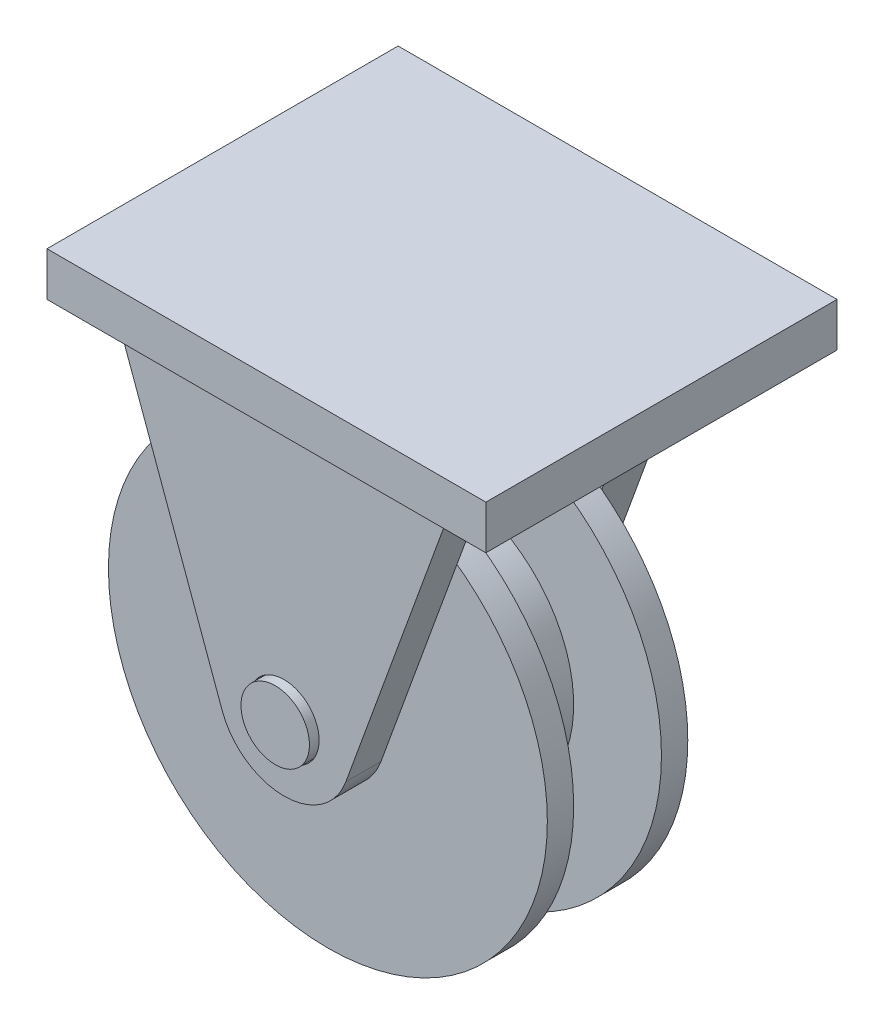
ISO-10303-21;
HEADER;
FILE_DESCRIPTION(('STEP AP214'),'2;1');
FILE_NAME('part.step','',(''),(''),'','','');
FILE_SCHEMA(('AUTOMOTIVE_DESIGN { 1 0 10303 214 1 1 1 1 }'));
ENDSEC;
DATA;
#1=APPLICATION_CONTEXT('core data for automotive mechanical design processes');
#2=APPLICATION_PROTOCOL_DEFINITION('international standard','automotive_design',2000,#1);
#3=PRODUCT_CONTEXT('',#1,'mechanical');
#4=PRODUCT('Part','Part','',(#3));
#5=PRODUCT_RELATED_PRODUCT_CATEGORY('part','',(#4));
#6=PRODUCT_DEFINITION_FORMATION('','',#4);
#7=PRODUCT_DEFINITION_CONTEXT('part definition',#1,'design');
#8=PRODUCT_DEFINITION('design','',#6,#7);
#9=PRODUCT_DEFINITION_SHAPE('','',#8);
#10=(LENGTH_UNIT() NAMED_UNIT(*) SI_UNIT(.MILLI.,.METRE.));
#11=(NAMED_UNIT(*) PLANE_ANGLE_UNIT() SI_UNIT($,.RADIAN.));
#12=(NAMED_UNIT(*) SI_UNIT($,.STERADIAN.) SOLID_ANGLE_UNIT());
#13=UNCERTAINTY_MEASURE_WITH_UNIT(LENGTH_MEASURE(1.E-05),#10,'distance_accuracy_value','');
#14=(GEOMETRIC_REPRESENTATION_CONTEXT(3) GLOBAL_UNCERTAINTY_ASSIGNED_CONTEXT((#13)) GLOBAL_UNIT_ASSIGNED_CONTEXT((#10,
#11,#12)) REPRESENTATION_CONTEXT('',''));
#15=CARTESIAN_POINT('',(0.,0.,0.));
#16=DIRECTION('',(0.,0.,1.));
#17=DIRECTION('',(1.,0.,0.));
#18=AXIS2_PLACEMENT_3D('',#15,#16,#17);
#19=CARTESIAN_POINT('',(0.,0.,-13.));
#20=DIRECTION('',(0.,0.,-1.));
#21=DIRECTION('',(1.,0.,0.));
#22=AXIS2_PLACEMENT_3D('',#19,#20,#21);
#23=PLANE('',#22);
#24=CARTESIAN_POINT('',(0.,0.,-13.));
#25=DIRECTION('',(0.,0.,1.));
#26=DIRECTION('',(1.,0.,0.));
#27=AXIS2_PLACEMENT_3D('',#24,#25,#26);
#28=CIRCLE('',#27,25.);
#29=CARTESIAN_POINT('',(-15.2043552157091,19.8450896313052,-13.));
#30=VERTEX_POINT('',#29);
#31=CARTESIAN_POINT('',(15.2043552157091,19.8450896313052,-13.));
#32=VERTEX_POINT('',#31);
#33=EDGE_CURVE('E92',#30,#32,#28,.T.);
#34=ORIENTED_EDGE('',*,*,#33,.F.);
#35=DIRECTION('',(0.342020143325663,-0.93969262078591,0.));
#36=VECTOR('',#35,1.);
#37=CARTESIAN_POINT('',(-18.9004403215552,30.,-13.));
#38=LINE('',#37,#36);
#39=CARTESIAN_POINT('',(-7.04769465589432,-2.56515107494247,-13.));
#40=VERTEX_POINT('',#39);
#41=EDGE_CURVE('E80',#30,#40,#38,.T.);
#42=ORIENTED_EDGE('',*,*,#41,.T.);
#43=CARTESIAN_POINT('',(0.,0.,-13.));
#44=DIRECTION('',(0.,0.,1.));
#45=DIRECTION('',(1.,0.,0.));
#46=AXIS2_PLACEMENT_3D('',#43,#44,#45);
#47=CIRCLE('',#46,7.5);
#48=CARTESIAN_POINT('',(7.04769465589432,-2.56515107494248,-13.));
#49=VERTEX_POINT('',#48);
#50=EDGE_CURVE('E302',#40,#49,#47,.T.);
#51=ORIENTED_EDGE('',*,*,#50,.T.);
#52=DIRECTION('',(-0.342020143325663,-0.93969262078591,0.));
#53=VECTOR('',#52,1.);
#54=CARTESIAN_POINT('',(18.9004403215552,30.,-13.));
#55=LINE('',#54,#53);
#56=EDGE_CURVE('E206',#32,#49,#55,.T.);
#57=ORIENTED_EDGE('',*,*,#56,.F.);
#58=EDGE_LOOP('',(#34,#42,#51,#57));
#59=FACE_BOUND('',#58,.T.);
#60=ADVANCED_FACE('F71',(#59),#23,.T.);
#61=CARTESIAN_POINT('',(0.,0.,3.));
#62=DIRECTION('',(0.,0.,-1.));
#63=DIRECTION('',(-1.,0.,0.));
#64=AXIS2_PLACEMENT_3D('',#61,#62,#63);
#65=CYLINDRICAL_SURFACE('',#64,25.);
#66=CARTESIAN_POINT('',(0.,0.,3.));
#67=DIRECTION('',(0.,0.,1.));
#68=DIRECTION('',(1.,0.,0.));
#69=AXIS2_PLACEMENT_3D('',#66,#67,#68);
#70=CIRCLE('',#69,25.);
#71=CARTESIAN_POINT('',(25.,0.,3.));
#72=VERTEX_POINT('',#71);
#73=EDGE_CURVE('E193',#72,#72,#70,.T.);
#74=ORIENTED_EDGE('',*,*,#73,.F.);
#75=EDGE_LOOP('',(#74));
#76=FACE_BOUND('',#75,.T.);
#77=CARTESIAN_POINT('',(0.,0.,0.));
#78=DIRECTION('',(0.,0.,1.));
#79=DIRECTION('',(1.,0.,0.));
#80=AXIS2_PLACEMENT_3D('',#77,#78,#79);
#81=CIRCLE('',#80,25.);
#82=CARTESIAN_POINT('',(25.,0.,0.));
#83=VERTEX_POINT('',#82);
#84=EDGE_CURVE('E75',#83,#83,#81,.T.);
#85=ORIENTED_EDGE('',*,*,#84,.T.);
#86=EDGE_LOOP('',(#85));
#87=FACE_BOUND('',#86,.T.);
#88=ADVANCED_FACE('F73',(#76,#87),#65,.T.);
#89=CARTESIAN_POINT('',(0.,0.,0.));
#90=DIRECTION('',(0.,0.,1.));
#91=DIRECTION('',(1.,0.,0.));
#92=AXIS2_PLACEMENT_3D('',#89,#90,#91);
#93=PLANE('',#92);
#94=CARTESIAN_POINT('',(0.,0.,0.));
#95=DIRECTION('',(0.,0.,-1.));
#96=DIRECTION('',(-1.,0.,0.));
#97=AXIS2_PLACEMENT_3D('',#94,#95,#96);
#98=CIRCLE('',#97,15.);
#99=CARTESIAN_POINT('',(-15.,0.,0.));
#100=VERTEX_POINT('',#99);
#101=EDGE_CURVE('E202',#100,#100,#98,.T.);
#102=ORIENTED_EDGE('',*,*,#101,.F.);
#103=EDGE_LOOP('',(#102));
#104=FACE_BOUND('',#103,.T.);
#105=ORIENTED_EDGE('',*,*,#84,.F.);
#106=EDGE_LOOP('',(#105));
#107=FACE_BOUND('',#106,.T.);
#108=ADVANCED_FACE('F348',(#104,#107),#93,.F.);
#109=CARTESIAN_POINT('',(0.,0.,8.));
#110=DIRECTION('',(0.,0.,1.));
#111=DIRECTION('',(1.,0.,0.));
#112=AXIS2_PLACEMENT_3D('',#109,#110,#111);
#113=PLANE('',#112);
#114=DIRECTION('',(1.,0.,0.));
#115=VECTOR('',#114,1.);
#116=CARTESIAN_POINT('',(-18.9004403215552,30.,8.));
#117=LINE('',#116,#115);
#118=CARTESIAN_POINT('',(-18.9004403215552,30.,8.));
#119=VERTEX_POINT('',#118);
#120=CARTESIAN_POINT('',(18.9004403215552,30.,8.));
#121=VERTEX_POINT('',#120);
#122=EDGE_CURVE('E226',#119,#121,#117,.T.);
#123=ORIENTED_EDGE('',*,*,#122,.F.);
#124=DIRECTION('',(0.342020143325663,-0.93969262078591,0.));
#125=VECTOR('',#124,1.);
#126=CARTESIAN_POINT('',(-18.9004403215552,30.,8.));
#127=LINE('',#126,#125);
#128=CARTESIAN_POINT('',(-7.04769465589432,-2.56515107494247,8.));
#129=VERTEX_POINT('',#128);
#130=EDGE_CURVE('E188',#119,#129,#127,.T.);
#131=ORIENTED_EDGE('',*,*,#130,.T.);
#132=CARTESIAN_POINT('',(0.,0.,8.));
#133=DIRECTION('',(0.,0.,1.));
#134=DIRECTION('',(1.,0.,0.));
#135=AXIS2_PLACEMENT_3D('',#132,#133,#134);
#136=CIRCLE('',#135,7.5);
#137=CARTESIAN_POINT('',(7.04769465589432,-2.56515107494248,8.));
#138=VERTEX_POINT('',#137);
#139=EDGE_CURVE('E230',#129,#138,#136,.T.);
#140=ORIENTED_EDGE('',*,*,#139,.T.);
#141=DIRECTION('',(-0.342020143325663,-0.93969262078591,0.));
#142=VECTOR('',#141,1.);
#143=CARTESIAN_POINT('',(18.9004403215552,30.,8.));
#144=LINE('',#143,#142);
#145=EDGE_CURVE('E228',#121,#138,#144,.T.);
#146=ORIENTED_EDGE('',*,*,#145,.F.);
#147=EDGE_LOOP('',(#123,#131,#140,#146));
#148=FACE_BOUND('',#147,.T.);
#149=CARTESIAN_POINT('',(0.,0.,8.));
#150=DIRECTION('',(0.,0.,1.));
#151=DIRECTION('',(1.,0.,0.));
#152=AXIS2_PLACEMENT_3D('',#149,#150,#151);
#153=CIRCLE('',#152,4.);
#154=CARTESIAN_POINT('',(4.,0.,8.));
#155=VERTEX_POINT('',#154);
#156=EDGE_CURVE('E220',#155,#155,#153,.T.);
#157=ORIENTED_EDGE('',*,*,#156,.F.);
#158=EDGE_LOOP('',(#157));
#159=FACE_BOUND('',#158,.T.);
#160=ADVANCED_FACE('F235',(#148,#159),#113,.T.);
#161=CARTESIAN_POINT('',(-18.9004403215552,30.,8.));
#162=DIRECTION('',(0.93969262078591,0.342020143325663,0.));
#163=DIRECTION('',(-0.342020143325663,0.93969262078591,0.));
#164=AXIS2_PLACEMENT_3D('',#161,#162,#163);
#165=PLANE('',#164);
#166=DIRECTION('',(0.,0.,-1.));
#167=VECTOR('',#166,1.);
#168=CARTESIAN_POINT('',(-18.9004403215552,30.,8.));
#169=LINE('',#168,#167);
#170=CARTESIAN_POINT('',(-18.9004403215552,30.,4.));
#171=VERTEX_POINT('',#170);
#172=EDGE_CURVE('E183',#119,#171,#169,.T.);
#173=ORIENTED_EDGE('',*,*,#172,.T.);
#174=DIRECTION('',(0.342020143325663,-0.93969262078591,0.));
#175=VECTOR('',#174,1.);
#176=CARTESIAN_POINT('',(-18.9004403215552,30.,4.));
#177=LINE('',#176,#175);
#178=CARTESIAN_POINT('',(-7.04769465589432,-2.56515107494247,4.));
#179=VERTEX_POINT('',#178);
#180=EDGE_CURVE('E165',#171,#179,#177,.T.);
#181=ORIENTED_EDGE('',*,*,#180,.T.);
#182=DIRECTION('',(0.,0.,-1.));
#183=VECTOR('',#182,1.);
#184=CARTESIAN_POINT('',(-7.04769465589432,-2.56515107494247,8.));
#185=LINE('',#184,#183);
#186=EDGE_CURVE('E190',#129,#179,#185,.T.);
#187=ORIENTED_EDGE('',*,*,#186,.F.);
#188=ORIENTED_EDGE('',*,*,#130,.F.);
#189=EDGE_LOOP('',(#173,#181,#187,#188));
#190=FACE_BOUND('',#189,.T.);
#191=ADVANCED_FACE('F187',(#190),#165,.F.);
#192=CARTESIAN_POINT('',(0.,0.,8.));
#193=DIRECTION('',(0.,0.,-1.));
#194=DIRECTION('',(-1.,0.,0.));
#195=AXIS2_PLACEMENT_3D('',#192,#193,#194);
#196=CYLINDRICAL_SURFACE('',#195,7.5);
#197=ORIENTED_EDGE('',*,*,#186,.T.);
#198=CARTESIAN_POINT('',(0.,0.,4.));
#199=DIRECTION('',(0.,0.,1.));
#200=DIRECTION('',(1.,0.,0.));
#201=AXIS2_PLACEMENT_3D('',#198,#199,#200);
#202=CIRCLE('',#201,7.5);
#203=CARTESIAN_POINT('',(7.04769465589432,-2.56515107494248,4.));
#204=VERTEX_POINT('',#203);
#205=EDGE_CURVE('E172',#179,#204,#202,.T.);
#206=ORIENTED_EDGE('',*,*,#205,.T.);
#207=DIRECTION('',(0.,0.,-1.));
#208=VECTOR('',#207,1.);
#209=CARTESIAN_POINT('',(7.04769465589432,-2.56515107494248,8.));
#210=LINE('',#209,#208);
#211=EDGE_CURVE('E194',#138,#204,#210,.T.);
#212=ORIENTED_EDGE('',*,*,#211,.F.);
#213=ORIENTED_EDGE('',*,*,#139,.F.);
#214=EDGE_LOOP('',(#197,#206,#212,#213));
#215=FACE_BOUND('',#214,.T.);
#216=ADVANCED_FACE('F238',(#215),#196,.T.);
#217=CARTESIAN_POINT('',(18.9004403215552,30.,8.));
#218=DIRECTION('',(0.93969262078591,-0.342020143325663,0.));
#219=DIRECTION('',(0.342020143325663,0.93969262078591,0.));
#220=AXIS2_PLACEMENT_3D('',#217,#218,#219);
#221=PLANE('',#220);
#222=DIRECTION('',(0.342020143325663,0.93969262078591,0.));
#223=VECTOR('',#222,1.);
#224=CARTESIAN_POINT('',(18.9004403215552,30.,4.));
#225=LINE('',#224,#223);
#226=CARTESIAN_POINT('',(18.9004403215552,30.,4.));
#227=VERTEX_POINT('',#226);
#228=EDGE_CURVE('E241',#204,#227,#225,.T.);
#229=ORIENTED_EDGE('',*,*,#228,.T.);
#230=DIRECTION('',(0.,0.,-1.));
#231=VECTOR('',#230,1.);
#232=CARTESIAN_POINT('',(18.9004403215552,30.,8.));
#233=LINE('',#232,#231);
#234=EDGE_CURVE('E184',#121,#227,#233,.T.);
#235=ORIENTED_EDGE('',*,*,#234,.F.);
#236=ORIENTED_EDGE('',*,*,#145,.T.);
#237=ORIENTED_EDGE('',*,*,#211,.T.);
#238=EDGE_LOOP('',(#229,#235,#236,#237));
#239=FACE_BOUND('',#238,.T.);
#240=ADVANCED_FACE('F240',(#239),#221,.T.);
#241=CARTESIAN_POINT('',(0.,0.,8.));
#242=DIRECTION('',(0.,0.,-1.));
#243=DIRECTION('',(-1.,0.,0.));
#244=AXIS2_PLACEMENT_3D('',#241,#242,#243);
#245=CYLINDRICAL_SURFACE('',#244,4.);
#246=CARTESIAN_POINT('',(0.,0.,4.));
#247=DIRECTION('',(0.,0.,1.));
#248=DIRECTION('',(1.,0.,0.));
#249=AXIS2_PLACEMENT_3D('',#246,#247,#248);
#250=CIRCLE('',#249,4.);
#251=CARTESIAN_POINT('',(4.,0.,4.));
#252=VERTEX_POINT('',#251);
#253=EDGE_CURVE('E185',#252,#252,#250,.T.);
#254=ORIENTED_EDGE('',*,*,#253,.F.);
#255=EDGE_LOOP('',(#254));
#256=FACE_BOUND('',#255,.T.);
#257=ORIENTED_EDGE('',*,*,#156,.T.);
#258=EDGE_LOOP('',(#257));
#259=FACE_BOUND('',#258,.T.);
#260=ADVANCED_FACE('F497',(#256,#259),#245,.F.);
#261=CARTESIAN_POINT('',(0.,0.,-10.));
#262=DIRECTION('',(0.,0.,1.));
#263=DIRECTION('',(1.,0.,0.));
#264=AXIS2_PLACEMENT_3D('',#261,#262,#263);
#265=CYLINDRICAL_SURFACE('',#264,15.);
#266=CARTESIAN_POINT('',(0.,0.,-10.));
#267=DIRECTION('',(0.,0.,-1.));
#268=DIRECTION('',(-1.,0.,0.));
#269=AXIS2_PLACEMENT_3D('',#266,#267,#268);
#270=CIRCLE('',#269,15.);
#271=CARTESIAN_POINT('',(-15.,0.,-10.));
#272=VERTEX_POINT('',#271);
#273=EDGE_CURVE('E215',#272,#272,#270,.T.);
#274=ORIENTED_EDGE('',*,*,#273,.F.);
#275=EDGE_LOOP('',(#274));
#276=FACE_BOUND('',#275,.T.);
#277=ORIENTED_EDGE('',*,*,#101,.T.);
#278=EDGE_LOOP('',(#277));
#279=FACE_BOUND('',#278,.T.);
#280=ADVANCED_FACE('F507',(#276,#279),#265,.T.);
#281=CARTESIAN_POINT('',(0.,0.,-13.));
#282=DIRECTION('',(0.,0.,1.));
#283=DIRECTION('',(1.,0.,0.));
#284=AXIS2_PLACEMENT_3D('',#281,#282,#283);
#285=CYLINDRICAL_SURFACE('',#284,25.);
#286=EDGE_CURVE('E316',#32,#30,#28,.T.);
#287=ORIENTED_EDGE('',*,*,#286,.T.);
#288=ORIENTED_EDGE('',*,*,#33,.T.);
#289=EDGE_LOOP('',(#287,#288));
#290=FACE_BOUND('',#289,.T.);
#291=CARTESIAN_POINT('',(0.,0.,-10.));
#292=DIRECTION('',(0.,0.,1.));
#293=DIRECTION('',(1.,0.,0.));
#294=AXIS2_PLACEMENT_3D('',#291,#292,#293);
#295=CIRCLE('',#294,25.);
#296=CARTESIAN_POINT('',(25.,0.,-10.));
#297=VERTEX_POINT('',#296);
#298=EDGE_CURVE('E308',#297,#297,#295,.T.);
#299=ORIENTED_EDGE('',*,*,#298,.F.);
#300=EDGE_LOOP('',(#299));
#301=FACE_BOUND('',#300,.T.);
#302=ADVANCED_FACE('F322',(#290,#301),#285,.T.);
#303=CARTESIAN_POINT('',(0.,0.,-10.));
#304=DIRECTION('',(0.,0.,-1.));
#305=DIRECTION('',(1.,0.,0.));
#306=AXIS2_PLACEMENT_3D('',#303,#304,#305);
#307=PLANE('',#306);
#308=ORIENTED_EDGE('',*,*,#273,.T.);
#309=EDGE_LOOP('',(#308));
#310=FACE_BOUND('',#309,.T.);
#311=ORIENTED_EDGE('',*,*,#298,.T.);
#312=EDGE_LOOP('',(#311));
#313=FACE_BOUND('',#312,.T.);
#314=ADVANCED_FACE('F382',(#310,#313),#307,.F.);
#315=CARTESIAN_POINT('',(18.9004403215552,30.,-18.));
#316=DIRECTION('',(-0.93969262078591,0.342020143325663,0.));
#317=DIRECTION('',(-0.342020143325663,-0.93969262078591,0.));
#318=AXIS2_PLACEMENT_3D('',#315,#316,#317);
#319=PLANE('',#318);
#320=CARTESIAN_POINT('',(18.9004403215552,30.,-13.));
#321=VERTEX_POINT('',#320);
#322=EDGE_CURVE('E212',#321,#32,#55,.T.);
#323=ORIENTED_EDGE('',*,*,#322,.T.);
#324=ORIENTED_EDGE('',*,*,#56,.T.);
#325=DIRECTION('',(0.,0.,1.));
#326=VECTOR('',#325,1.);
#327=CARTESIAN_POINT('',(7.04769465589432,-2.56515107494248,-18.));
#328=LINE('',#327,#326);
#329=CARTESIAN_POINT('',(7.04769465589432,-2.56515107494248,-18.));
#330=VERTEX_POINT('',#329);
#331=EDGE_CURVE('E309',#330,#49,#328,.T.);
#332=ORIENTED_EDGE('',*,*,#331,.F.);
#333=DIRECTION('',(-0.342020143325663,-0.93969262078591,0.));
#334=VECTOR('',#333,1.);
#335=CARTESIAN_POINT('',(18.9004403215552,30.,-18.));
#336=LINE('',#335,#334);
#337=CARTESIAN_POINT('',(18.9004403215552,30.,-18.));
#338=VERTEX_POINT('',#337);
#339=EDGE_CURVE('E294',#338,#330,#336,.T.);
#340=ORIENTED_EDGE('',*,*,#339,.F.);
#341=DIRECTION('',(0.,0.,1.));
#342=VECTOR('',#341,1.);
#343=CARTESIAN_POINT('',(18.9004403215552,30.,-18.));
#344=LINE('',#343,#342);
#345=EDGE_CURVE('E305',#338,#321,#344,.T.);
#346=ORIENTED_EDGE('',*,*,#345,.T.);
#347=EDGE_LOOP('',(#323,#324,#332,#340,#346));
#348=FACE_BOUND('',#347,.T.);
#349=ADVANCED_FACE('F328',(#348),#319,.F.);
#350=CARTESIAN_POINT('',(0.,0.,-18.));
#351=DIRECTION('',(0.,0.,1.));
#352=DIRECTION('',(1.,0.,0.));
#353=AXIS2_PLACEMENT_3D('',#350,#351,#352);
#354=CYLINDRICAL_SURFACE('',#353,7.5);
#355=ORIENTED_EDGE('',*,*,#50,.F.);
#356=DIRECTION('',(0.,0.,1.));
#357=VECTOR('',#356,1.);
#358=CARTESIAN_POINT('',(-7.04769465589432,-2.56515107494247,-18.));
#359=LINE('',#358,#357);
#360=CARTESIAN_POINT('',(-7.04769465589432,-2.56515107494247,-18.));
#361=VERTEX_POINT('',#360);
#362=EDGE_CURVE('E312',#361,#40,#359,.T.);
#363=ORIENTED_EDGE('',*,*,#362,.F.);
#364=CARTESIAN_POINT('',(0.,0.,-18.));
#365=DIRECTION('',(0.,0.,1.));
#366=DIRECTION('',(1.,0.,0.));
#367=AXIS2_PLACEMENT_3D('',#364,#365,#366);
#368=CIRCLE('',#367,7.5);
#369=EDGE_CURVE('E291',#361,#330,#368,.T.);
#370=ORIENTED_EDGE('',*,*,#369,.T.);
#371=ORIENTED_EDGE('',*,*,#331,.T.);
#372=EDGE_LOOP('',(#355,#363,#370,#371));
#373=FACE_BOUND('',#372,.T.);
#374=ADVANCED_FACE('F341',(#373),#354,.T.);
#375=CARTESIAN_POINT('',(-18.9004403215552,30.,-18.));
#376=DIRECTION('',(-0.93969262078591,-0.342020143325663,0.));
#377=DIRECTION('',(0.342020143325663,-0.93969262078591,0.));
#378=AXIS2_PLACEMENT_3D('',#375,#376,#377);
#379=PLANE('',#378);
#380=CARTESIAN_POINT('',(-18.9004403215552,30.,-13.));
#381=VERTEX_POINT('',#380);
#382=EDGE_CURVE('E299',#381,#30,#38,.T.);
#383=ORIENTED_EDGE('',*,*,#382,.F.);
#384=DIRECTION('',(0.,0.,1.));
#385=VECTOR('',#384,1.);
#386=CARTESIAN_POINT('',(-18.9004403215552,30.,-18.));
#387=LINE('',#386,#385);
#388=CARTESIAN_POINT('',(-18.9004403215552,30.,-18.));
#389=VERTEX_POINT('',#388);
#390=EDGE_CURVE('E296',#389,#381,#387,.T.);
#391=ORIENTED_EDGE('',*,*,#390,.F.);
#392=DIRECTION('',(0.342020143325663,-0.93969262078591,0.));
#393=VECTOR('',#392,1.);
#394=CARTESIAN_POINT('',(-18.9004403215552,30.,-18.));
#395=LINE('',#394,#393);
#396=EDGE_CURVE('E288',#389,#361,#395,.T.);
#397=ORIENTED_EDGE('',*,*,#396,.T.);
#398=ORIENTED_EDGE('',*,*,#362,.T.);
#399=ORIENTED_EDGE('',*,*,#41,.F.);
#400=EDGE_LOOP('',(#383,#391,#397,#398,#399));
#401=FACE_BOUND('',#400,.T.);
#402=ADVANCED_FACE('F335',(#401),#379,.T.);
#403=CARTESIAN_POINT('',(0.,0.,-18.));
#404=DIRECTION('',(0.,0.,-1.));
#405=DIRECTION('',(1.,0.,0.));
#406=AXIS2_PLACEMENT_3D('',#403,#404,#405);
#407=PLANE('',#406);
#408=CARTESIAN_POINT('',(0.,0.,-18.));
#409=DIRECTION('',(0.,0.,1.));
#410=DIRECTION('',(1.,0.,0.));
#411=AXIS2_PLACEMENT_3D('',#408,#409,#410);
#412=CIRCLE('',#411,4.);
#413=CARTESIAN_POINT('',(4.,0.,-18.));
#414=VERTEX_POINT('',#413);
#415=EDGE_CURVE('E279',#414,#414,#412,.T.);
#416=ORIENTED_EDGE('',*,*,#415,.T.);
#417=EDGE_LOOP('',(#416));
#418=FACE_BOUND('',#417,.T.);
#419=DIRECTION('',(1.,0.,0.));
#420=VECTOR('',#419,1.);
#421=CARTESIAN_POINT('',(-18.9004403215552,30.,-18.));
#422=LINE('',#421,#420);
#423=EDGE_CURVE('E285',#389,#338,#422,.T.);
#424=ORIENTED_EDGE('',*,*,#423,.T.);
#425=ORIENTED_EDGE('',*,*,#339,.T.);
#426=ORIENTED_EDGE('',*,*,#369,.F.);
#427=ORIENTED_EDGE('',*,*,#396,.F.);
#428=EDGE_LOOP('',(#424,#425,#426,#427));
#429=FACE_BOUND('',#428,.T.);
#430=ADVANCED_FACE('F338',(#418,#429),#407,.T.);
#431=CARTESIAN_POINT('',(0.,0.,-13.));
#432=DIRECTION('',(0.,0.,-1.));
#433=DIRECTION('',(1.,0.,0.));
#434=AXIS2_PLACEMENT_3D('',#431,#432,#433);
#435=PLANE('',#434);
#436=ORIENTED_EDGE('',*,*,#286,.F.);
#437=ORIENTED_EDGE('',*,*,#322,.F.);
#438=DIRECTION('',(1.,0.,0.));
#439=VECTOR('',#438,1.);
#440=CARTESIAN_POINT('',(-18.9004403215552,30.,-13.));
#441=LINE('',#440,#439);
#442=EDGE_CURVE('E283',#381,#321,#441,.T.);
#443=ORIENTED_EDGE('',*,*,#442,.F.);
#444=ORIENTED_EDGE('',*,*,#382,.T.);
#445=EDGE_LOOP('',(#436,#437,#443,#444));
#446=FACE_BOUND('',#445,.T.);
#447=ADVANCED_FACE('F325',(#446),#435,.F.);
#448=CARTESIAN_POINT('',(0.,0.,-18.));
#449=DIRECTION('',(0.,0.,1.));
#450=DIRECTION('',(1.,0.,0.));
#451=AXIS2_PLACEMENT_3D('',#448,#449,#450);
#452=CYLINDRICAL_SURFACE('',#451,4.);
#453=ORIENTED_EDGE('',*,*,#415,.F.);
#454=EDGE_LOOP('',(#453));
#455=FACE_BOUND('',#454,.T.);
#456=CARTESIAN_POINT('',(0.,0.,-13.));
#457=DIRECTION('',(0.,0.,1.));
#458=DIRECTION('',(1.,0.,0.));
#459=AXIS2_PLACEMENT_3D('',#456,#457,#458);
#460=CIRCLE('',#459,4.);
#461=CARTESIAN_POINT('',(4.,0.,-13.));
#462=VERTEX_POINT('',#461);
#463=EDGE_CURVE('E12',#462,#462,#460,.T.);
#464=ORIENTED_EDGE('',*,*,#463,.T.);
#465=EDGE_LOOP('',(#464));
#466=FACE_BOUND('',#465,.T.);
#467=ADVANCED_FACE('F354',(#455,#466),#452,.F.);
#468=CARTESIAN_POINT('',(0.,0.,-13.));
#469=DIRECTION('',(0.,0.,-1.));
#470=DIRECTION('',(-1.,0.,0.));
#471=AXIS2_PLACEMENT_3D('',#468,#469,#470);
#472=CIRCLE('',#471,3.9);
#473=CARTESIAN_POINT('',(-3.9,0.,-13.));
#474=VERTEX_POINT('',#473);
#475=EDGE_CURVE('E275',#474,#474,#472,.T.);
#476=ORIENTED_EDGE('',*,*,#475,.F.);
#477=EDGE_LOOP('',(#476));
#478=FACE_BOUND('',#477,.T.);
#479=ORIENTED_EDGE('',*,*,#463,.F.);
#480=EDGE_LOOP('',(#479));
#481=FACE_BOUND('',#480,.T.);
#482=ADVANCED_FACE('F344',(#478,#481),#23,.T.);
#483=CARTESIAN_POINT('',(0.,0.,-19.));
#484=DIRECTION('',(0.,0.,1.));
#485=DIRECTION('',(1.,0.,0.));
#486=AXIS2_PLACEMENT_3D('',#483,#484,#485);
#487=CYLINDRICAL_SURFACE('',#486,3.9);
#488=CARTESIAN_POINT('',(0.,0.,-19.));
#489=DIRECTION('',(0.,0.,-1.));
#490=DIRECTION('',(-1.,0.,0.));
#491=AXIS2_PLACEMENT_3D('',#488,#489,#490);
#492=CIRCLE('',#491,3.9);
#493=CARTESIAN_POINT('',(-3.9,0.,-19.));
#494=VERTEX_POINT('',#493);
#495=EDGE_CURVE('E276',#494,#494,#492,.T.);
#496=ORIENTED_EDGE('',*,*,#495,.F.);
#497=EDGE_LOOP('',(#496));
#498=FACE_BOUND('',#497,.T.);
#499=ORIENTED_EDGE('',*,*,#475,.T.);
#500=EDGE_LOOP('',(#499));
#501=FACE_BOUND('',#500,.T.);
#502=ADVANCED_FACE('F353',(#498,#501),#487,.T.);
#503=CARTESIAN_POINT('',(0.,0.,-19.));
#504=DIRECTION('',(0.,0.,-1.));
#505=DIRECTION('',(-1.,0.,0.));
#506=AXIS2_PLACEMENT_3D('',#503,#504,#505);
#507=PLANE('',#506);
#508=ORIENTED_EDGE('',*,*,#495,.T.);
#509=EDGE_LOOP('',(#508));
#510=FACE_BOUND('',#509,.T.);
#511=ADVANCED_FACE('F360',(#510),#507,.T.);
#512=CARTESIAN_POINT('',(0.,30.,0.));
#513=DIRECTION('',(0.,-1.,0.));
#514=DIRECTION('',(0.,0.,-1.));
#515=AXIS2_PLACEMENT_3D('',#512,#513,#514);
#516=PLANE('',#515);
#517=DIRECTION('',(0.,0.,-1.));
#518=VECTOR('',#517,1.);
#519=CARTESIAN_POINT('',(25.,30.,9.99999999999999));
#520=LINE('',#519,#518);
#521=CARTESIAN_POINT('',(25.,30.,9.99999999999999));
#522=VERTEX_POINT('',#521);
#523=CARTESIAN_POINT('',(25.,30.,-30.));
#524=VERTEX_POINT('',#523);
#525=EDGE_CURVE('E242',#522,#524,#520,.T.);
#526=ORIENTED_EDGE('',*,*,#525,.F.);
#527=DIRECTION('',(1.,0.,0.));
#528=VECTOR('',#527,1.);
#529=CARTESIAN_POINT('',(-25.,30.,10.));
#530=LINE('',#529,#528);
#531=CARTESIAN_POINT('',(-25.,30.,10.));
#532=VERTEX_POINT('',#531);
#533=EDGE_CURVE('E253',#532,#522,#530,.T.);
#534=ORIENTED_EDGE('',*,*,#533,.F.);
#535=DIRECTION('',(0.,0.,1.));
#536=VECTOR('',#535,1.);
#537=CARTESIAN_POINT('',(-25.,30.,10.));
#538=LINE('',#537,#536);
#539=CARTESIAN_POINT('',(-25.,30.,-30.));
#540=VERTEX_POINT('',#539);
#541=EDGE_CURVE('E261',#540,#532,#538,.T.);
#542=ORIENTED_EDGE('',*,*,#541,.F.);
#543=DIRECTION('',(-1.,0.,0.));
#544=VECTOR('',#543,1.);
#545=CARTESIAN_POINT('',(-25.,30.,-30.));
#546=LINE('',#545,#544);
#547=EDGE_CURVE('E245',#524,#540,#546,.T.);
#548=ORIENTED_EDGE('',*,*,#547,.F.);
#549=EDGE_LOOP('',(#526,#534,#542,#548));
#550=FACE_BOUND('',#549,.T.);
#551=ORIENTED_EDGE('',*,*,#390,.T.);
#552=ORIENTED_EDGE('',*,*,#442,.T.);
#553=ORIENTED_EDGE('',*,*,#345,.F.);
#554=ORIENTED_EDGE('',*,*,#423,.F.);
#555=EDGE_LOOP('',(#551,#552,#553,#554));
#556=FACE_BOUND('',#555,.T.);
#557=DIRECTION('',(-1.,0.,0.));
#558=VECTOR('',#557,1.);
#559=CARTESIAN_POINT('',(-18.9004403215552,30.,4.));
#560=LINE('',#559,#558);
#561=EDGE_CURVE('E169',#227,#171,#560,.T.);
#562=ORIENTED_EDGE('',*,*,#561,.T.);
#563=ORIENTED_EDGE('',*,*,#172,.F.);
#564=ORIENTED_EDGE('',*,*,#122,.T.);
#565=ORIENTED_EDGE('',*,*,#234,.T.);
#566=EDGE_LOOP('',(#562,#563,#564,#565));
#567=FACE_BOUND('',#566,.T.);
#568=ADVANCED_FACE('F181',(#550,#556,#567),#516,.T.);
#569=CARTESIAN_POINT('',(25.,35.,9.99999999999999));
#570=DIRECTION('',(-1.,0.,0.));
#571=DIRECTION('',(0.,0.,1.));
#572=AXIS2_PLACEMENT_3D('',#569,#570,#571);
#573=PLANE('',#572);
#574=ORIENTED_EDGE('',*,*,#525,.T.);
#575=DIRECTION('',(0.,-1.,0.));
#576=VECTOR('',#575,1.);
#577=CARTESIAN_POINT('',(25.,35.,-30.));
#578=LINE('',#577,#576);
#579=CARTESIAN_POINT('',(25.,35.,-30.));
#580=VERTEX_POINT('',#579);
#581=EDGE_CURVE('E272',#580,#524,#578,.T.);
#582=ORIENTED_EDGE('',*,*,#581,.F.);
#583=DIRECTION('',(0.,0.,-1.));
#584=VECTOR('',#583,1.);
#585=CARTESIAN_POINT('',(25.,35.,9.99999999999999));
#586=LINE('',#585,#584);
#587=CARTESIAN_POINT('',(25.,35.,9.99999999999999));
#588=VERTEX_POINT('',#587);
#589=EDGE_CURVE('E249',#588,#580,#586,.T.);
#590=ORIENTED_EDGE('',*,*,#589,.F.);
#591=DIRECTION('',(0.,-1.,0.));
#592=VECTOR('',#591,1.);
#593=CARTESIAN_POINT('',(25.,35.,9.99999999999999));
#594=LINE('',#593,#592);
#595=EDGE_CURVE('E258',#588,#522,#594,.T.);
#596=ORIENTED_EDGE('',*,*,#595,.T.);
#597=EDGE_LOOP('',(#574,#582,#590,#596));
#598=FACE_BOUND('',#597,.T.);
#599=ADVANCED_FACE('F405',(#598),#573,.F.);
#600=CARTESIAN_POINT('',(-25.,35.,-30.));
#601=DIRECTION('',(0.,0.,1.));
#602=DIRECTION('',(1.,0.,0.));
#603=AXIS2_PLACEMENT_3D('',#600,#601,#602);
#604=PLANE('',#603);
#605=ORIENTED_EDGE('',*,*,#547,.T.);
#606=DIRECTION('',(0.,-1.,0.));
#607=VECTOR('',#606,1.);
#608=CARTESIAN_POINT('',(-25.,35.,-30.));
#609=LINE('',#608,#607);
#610=CARTESIAN_POINT('',(-25.,35.,-30.));
#611=VERTEX_POINT('',#610);
#612=EDGE_CURVE('E269',#611,#540,#609,.T.);
#613=ORIENTED_EDGE('',*,*,#612,.F.);
#614=DIRECTION('',(-1.,0.,0.));
#615=VECTOR('',#614,1.);
#616=CARTESIAN_POINT('',(-25.,35.,-30.));
#617=LINE('',#616,#615);
#618=EDGE_CURVE('E252',#580,#611,#617,.T.);
#619=ORIENTED_EDGE('',*,*,#618,.F.);
#620=ORIENTED_EDGE('',*,*,#581,.T.);
#621=EDGE_LOOP('',(#605,#613,#619,#620));
#622=FACE_BOUND('',#621,.T.);
#623=ADVANCED_FACE('F410',(#622),#604,.F.);
#624=CARTESIAN_POINT('',(-25.,35.,10.));
#625=DIRECTION('',(1.,0.,0.));
#626=DIRECTION('',(0.,0.,-1.));
#627=AXIS2_PLACEMENT_3D('',#624,#625,#626);
#628=PLANE('',#627);
#629=ORIENTED_EDGE('',*,*,#541,.T.);
#630=DIRECTION('',(0.,-1.,0.));
#631=VECTOR('',#630,1.);
#632=CARTESIAN_POINT('',(-25.,35.,10.));
#633=LINE('',#632,#631);
#634=CARTESIAN_POINT('',(-25.,35.,10.));
#635=VERTEX_POINT('',#634);
#636=EDGE_CURVE('E266',#635,#532,#633,.T.);
#637=ORIENTED_EDGE('',*,*,#636,.F.);
#638=DIRECTION('',(0.,0.,1.));
#639=VECTOR('',#638,1.);
#640=CARTESIAN_POINT('',(-25.,35.,10.));
#641=LINE('',#640,#639);
#642=EDGE_CURVE('E255',#611,#635,#641,.T.);
#643=ORIENTED_EDGE('',*,*,#642,.F.);
#644=ORIENTED_EDGE('',*,*,#612,.T.);
#645=EDGE_LOOP('',(#629,#637,#643,#644));
#646=FACE_BOUND('',#645,.T.);
#647=ADVANCED_FACE('F423',(#646),#628,.F.);
#648=CARTESIAN_POINT('',(-25.,35.,10.));
#649=DIRECTION('',(0.,0.,-1.));
#650=DIRECTION('',(-1.,0.,0.));
#651=AXIS2_PLACEMENT_3D('',#648,#649,#650);
#652=PLANE('',#651);
#653=ORIENTED_EDGE('',*,*,#533,.T.);
#654=ORIENTED_EDGE('',*,*,#595,.F.);
#655=DIRECTION('',(1.,0.,0.));
#656=VECTOR('',#655,1.);
#657=CARTESIAN_POINT('',(-25.,35.,10.));
#658=LINE('',#657,#656);
#659=EDGE_CURVE('E257',#635,#588,#658,.T.);
#660=ORIENTED_EDGE('',*,*,#659,.F.);
#661=ORIENTED_EDGE('',*,*,#636,.T.);
#662=EDGE_LOOP('',(#653,#654,#660,#661));
#663=FACE_BOUND('',#662,.T.);
#664=ADVANCED_FACE('F434',(#663),#652,.F.);
#665=CARTESIAN_POINT('',(0.,35.,0.));
#666=DIRECTION('',(0.,-1.,0.));
#667=DIRECTION('',(0.,0.,-1.));
#668=AXIS2_PLACEMENT_3D('',#665,#666,#667);
#669=PLANE('',#668);
#670=ORIENTED_EDGE('',*,*,#589,.T.);
#671=ORIENTED_EDGE('',*,*,#618,.T.);
#672=ORIENTED_EDGE('',*,*,#642,.T.);
#673=ORIENTED_EDGE('',*,*,#659,.T.);
#674=EDGE_LOOP('',(#670,#671,#672,#673));
#675=FACE_BOUND('',#674,.T.);
#676=ADVANCED_FACE('F445',(#675),#669,.F.);
#677=CARTESIAN_POINT('',(0.,0.,4.));
#678=DIRECTION('',(0.,0.,1.));
#679=DIRECTION('',(1.,0.,0.));
#680=AXIS2_PLACEMENT_3D('',#677,#678,#679);
#681=PLANE('',#680);
#682=ORIENTED_EDGE('',*,*,#561,.F.);
#683=ORIENTED_EDGE('',*,*,#228,.F.);
#684=ORIENTED_EDGE('',*,*,#205,.F.);
#685=ORIENTED_EDGE('',*,*,#180,.F.);
#686=EDGE_LOOP('',(#682,#683,#684,#685));
#687=FACE_BOUND('',#686,.T.);
#688=ORIENTED_EDGE('',*,*,#253,.T.);
#689=EDGE_LOOP('',(#688));
#690=FACE_BOUND('',#689,.T.);
#691=ADVANCED_FACE('F167',(#687,#690),#681,.F.);
#692=CARTESIAN_POINT('',(0.,0.,9.));
#693=DIRECTION('',(0.,0.,1.));
#694=DIRECTION('',(1.,0.,0.));
#695=AXIS2_PLACEMENT_3D('',#692,#693,#694);
#696=PLANE('',#695);
#697=CARTESIAN_POINT('',(0.,0.,9.));
#698=DIRECTION('',(0.,0.,1.));
#699=DIRECTION('',(1.,0.,0.));
#700=AXIS2_PLACEMENT_3D('',#697,#698,#699);
#701=CIRCLE('',#700,3.9);
#702=CARTESIAN_POINT('',(3.9,0.,9.));
#703=VERTEX_POINT('',#702);
#704=EDGE_CURVE('E217',#703,#703,#701,.T.);
#705=ORIENTED_EDGE('',*,*,#704,.T.);
#706=EDGE_LOOP('',(#705));
#707=FACE_BOUND('',#706,.T.);
#708=ADVANCED_FACE('F527',(#707),#696,.T.);
#709=CARTESIAN_POINT('',(0.,0.,9.));
#710=DIRECTION('',(0.,0.,-1.));
#711=DIRECTION('',(-1.,0.,0.));
#712=AXIS2_PLACEMENT_3D('',#709,#710,#711);
#713=CYLINDRICAL_SURFACE('',#712,3.9);
#714=ORIENTED_EDGE('',*,*,#704,.F.);
#715=EDGE_LOOP('',(#714));
#716=FACE_BOUND('',#715,.T.);
#717=CARTESIAN_POINT('',(0.,0.,3.));
#718=DIRECTION('',(0.,0.,1.));
#719=DIRECTION('',(1.,0.,0.));
#720=AXIS2_PLACEMENT_3D('',#717,#718,#719);
#721=CIRCLE('',#720,3.9);
#722=CARTESIAN_POINT('',(3.9,0.,3.));
#723=VERTEX_POINT('',#722);
#724=EDGE_CURVE('E221',#723,#723,#721,.T.);
#725=ORIENTED_EDGE('',*,*,#724,.T.);
#726=EDGE_LOOP('',(#725));
#727=FACE_BOUND('',#726,.T.);
#728=ADVANCED_FACE('F538',(#716,#727),#713,.T.);
#729=CARTESIAN_POINT('',(0.,0.,3.));
#730=DIRECTION('',(0.,0.,1.));
#731=DIRECTION('',(1.,0.,0.));
#732=AXIS2_PLACEMENT_3D('',#729,#730,#731);
#733=PLANE('',#732);
#734=ORIENTED_EDGE('',*,*,#724,.F.);
#735=EDGE_LOOP('',(#734));
#736=FACE_BOUND('',#735,.T.);
#737=ORIENTED_EDGE('',*,*,#73,.T.);
#738=EDGE_LOOP('',(#737));
#739=FACE_BOUND('',#738,.T.);
#740=ADVANCED_FACE('F535',(#736,#739),#733,.T.);
#741=CLOSED_SHELL('',(#60,#88,#108,#160,#191,#216,#240,#260,#280,#302,#314,#349,#374,#402,#430,
#447,#467,#482,#502,#511,#568,#599,#623,#647,#664,#676,#691,#708,#728,#740));
#742=MANIFOLD_SOLID_BREP('B2',#741);
#743=ADVANCED_BREP_SHAPE_REPRESENTATION('',(#18,#742),#14);
#744=SHAPE_DEFINITION_REPRESENTATION(#9,#743);
ENDSEC;
END-ISO-10303-21;
